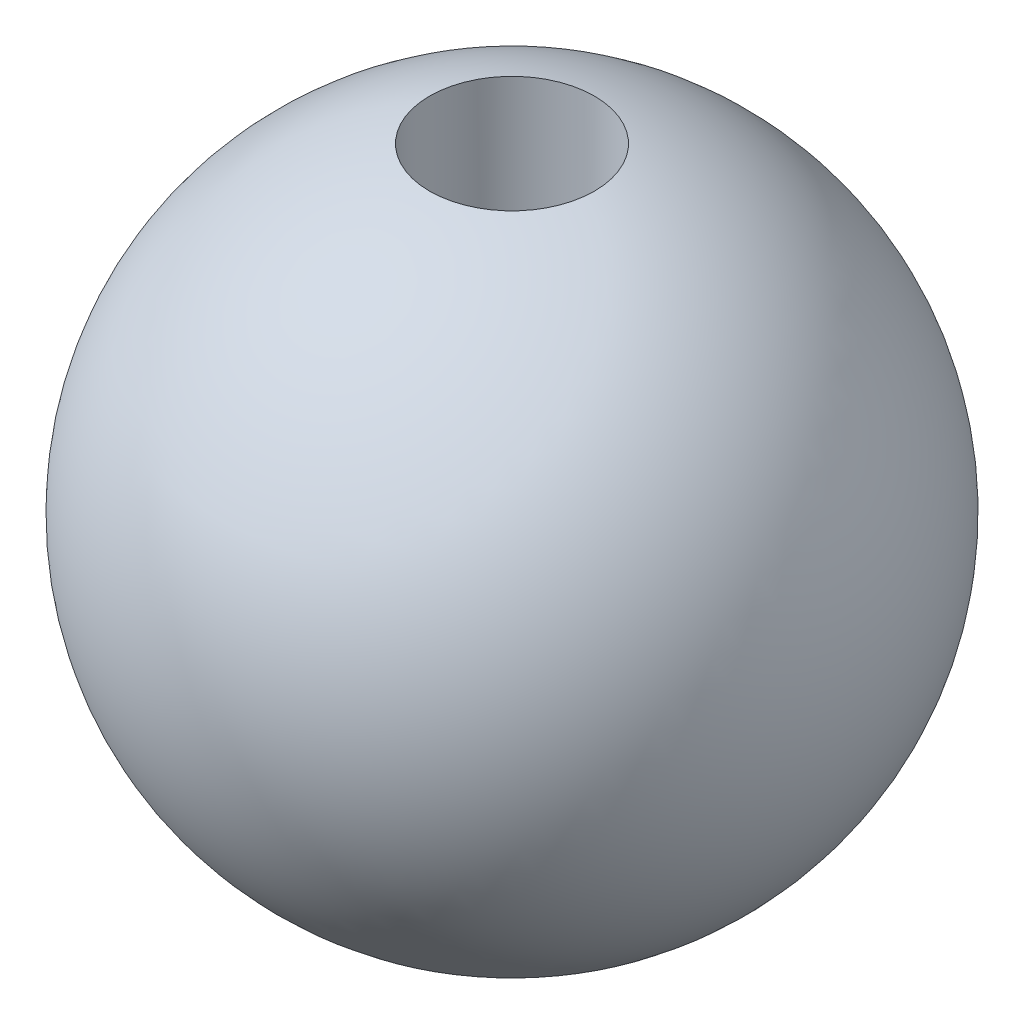
ISO-10303-21;
HEADER;
FILE_DESCRIPTION(('STEP AP214'),'2;1');
FILE_NAME('part.step','',(''),(''),'','','');
FILE_SCHEMA(('AUTOMOTIVE_DESIGN { 1 0 10303 214 1 1 1 1 }'));
ENDSEC;
DATA;
#1=APPLICATION_CONTEXT('core data for automotive mechanical design processes');
#2=APPLICATION_PROTOCOL_DEFINITION('international standard','automotive_design',2000,#1);
#3=PRODUCT_CONTEXT('',#1,'mechanical');
#4=PRODUCT('Part','Part','',(#3));
#5=PRODUCT_RELATED_PRODUCT_CATEGORY('part','',(#4));
#6=PRODUCT_DEFINITION_FORMATION('','',#4);
#7=PRODUCT_DEFINITION_CONTEXT('part definition',#1,'design');
#8=PRODUCT_DEFINITION('design','',#6,#7);
#9=PRODUCT_DEFINITION_SHAPE('','',#8);
#10=(LENGTH_UNIT() NAMED_UNIT(*) SI_UNIT(.MILLI.,.METRE.));
#11=(NAMED_UNIT(*) PLANE_ANGLE_UNIT() SI_UNIT($,.RADIAN.));
#12=(NAMED_UNIT(*) SI_UNIT($,.STERADIAN.) SOLID_ANGLE_UNIT());
#13=UNCERTAINTY_MEASURE_WITH_UNIT(LENGTH_MEASURE(1.E-05),#10,'distance_accuracy_value','');
#14=(GEOMETRIC_REPRESENTATION_CONTEXT(3) GLOBAL_UNCERTAINTY_ASSIGNED_CONTEXT((#13)) GLOBAL_UNIT_ASSIGNED_CONTEXT((#10,
#11,#12)) REPRESENTATION_CONTEXT('',''));
#15=CARTESIAN_POINT('',(0.,0.,0.));
#16=DIRECTION('',(0.,0.,1.));
#17=DIRECTION('',(1.,0.,0.));
#18=AXIS2_PLACEMENT_3D('',#15,#16,#17);
#19=CARTESIAN_POINT('',(0.,0.,0.));
#20=DIRECTION('',(0.,1.,0.));
#21=DIRECTION('',(1.,0.,0.));
#22=AXIS2_PLACEMENT_3D('',#19,#20,#21);
#23=SPHERICAL_SURFACE('',#22,10.);
#24=CARTESIAN_POINT('',(0.,9.68245836551855,0.));
#25=DIRECTION('',(0.,-1.,0.));
#26=DIRECTION('',(0.,0.,-1.));
#27=AXIS2_PLACEMENT_3D('',#24,#25,#26);
#28=CIRCLE('',#27,2.49999999999999);
#29=CARTESIAN_POINT('',(0.,9.68245836551855,-2.49999999999999));
#30=VERTEX_POINT('',#29);
#31=EDGE_CURVE('E10',#30,#30,#28,.F.);
#32=ORIENTED_EDGE('',*,*,#31,.F.);
#33=EDGE_LOOP('',(#32));
#34=FACE_BOUND('',#33,.T.);
#35=ADVANCED_FACE('F34',(#34),#23,.T.);
#36=CARTESIAN_POINT('',(0.,4.,0.));
#37=DIRECTION('',(0.,-1.,0.));
#38=DIRECTION('',(0.,0.,-1.));
#39=AXIS2_PLACEMENT_3D('',#36,#37,#38);
#40=PLANE('',#39);
#41=CARTESIAN_POINT('',(0.,3.99999999999999,0.));
#42=DIRECTION('',(0.,1.,0.));
#43=DIRECTION('',(0.,0.,1.));
#44=AXIS2_PLACEMENT_3D('',#41,#42,#43);
#45=CIRCLE('',#44,2.49999999999999);
#46=CARTESIAN_POINT('',(0.,3.99999999999999,2.49999999999999));
#47=VERTEX_POINT('',#46);
#48=EDGE_CURVE('E40',#47,#47,#45,.T.);
#49=ORIENTED_EDGE('',*,*,#48,.T.);
#50=EDGE_LOOP('',(#49));
#51=FACE_BOUND('',#50,.T.);
#52=ADVANCED_FACE('F46',(#51),#40,.F.);
#53=CARTESIAN_POINT('',(0.,10.,0.));
#54=DIRECTION('',(0.,1.,0.));
#55=DIRECTION('',(0.,0.,1.));
#56=AXIS2_PLACEMENT_3D('',#53,#54,#55);
#57=CYLINDRICAL_SURFACE('',#56,2.49999999999999);
#58=ORIENTED_EDGE('',*,*,#31,.T.);
#59=EDGE_LOOP('',(#58));
#60=FACE_BOUND('',#59,.T.);
#61=ORIENTED_EDGE('',*,*,#48,.F.);
#62=EDGE_LOOP('',(#61));
#63=FACE_BOUND('',#62,.T.);
#64=ADVANCED_FACE('F48',(#60,#63),#57,.F.);
#65=CLOSED_SHELL('',(#35,#52,#64));
#66=MANIFOLD_SOLID_BREP('B2',#65);
#67=ADVANCED_BREP_SHAPE_REPRESENTATION('',(#18,#66),#14);
#68=SHAPE_DEFINITION_REPRESENTATION(#9,#67);
ENDSEC;
END-ISO-10303-21;
